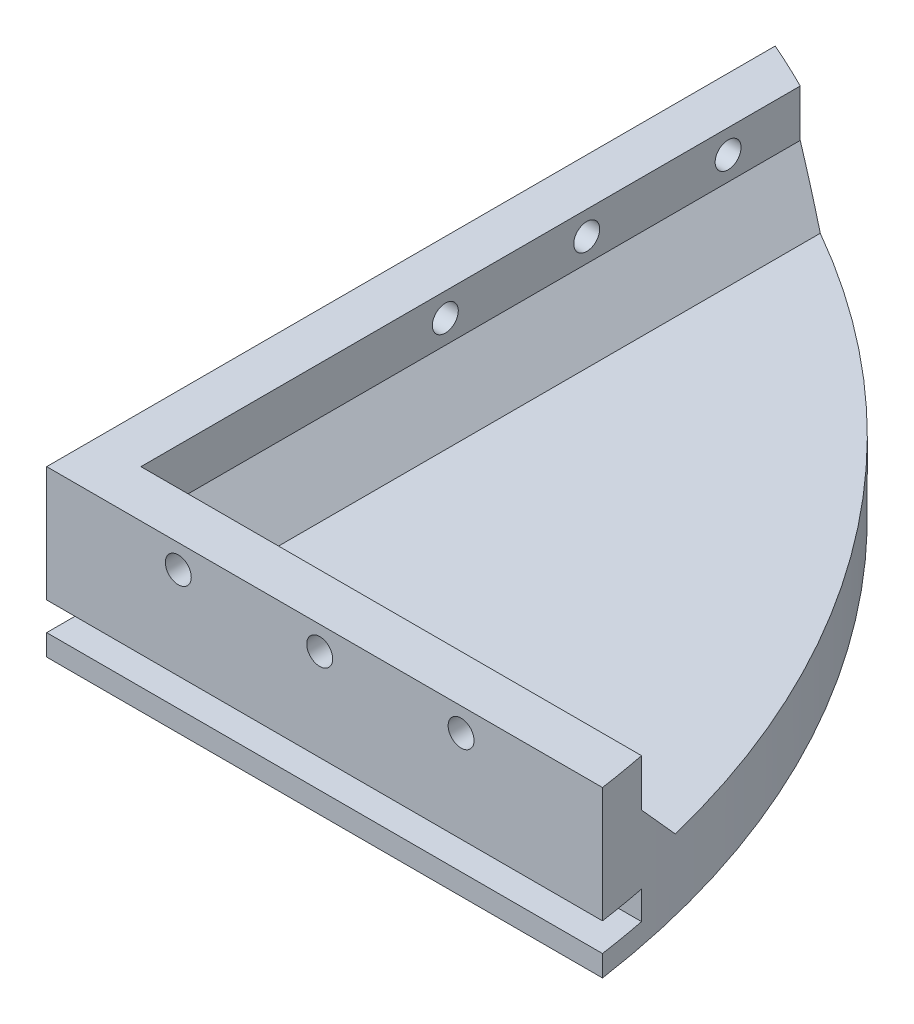
ISO-10303-21;
HEADER;
FILE_DESCRIPTION(('STEP AP214'),'2;1');
FILE_NAME('part.step','',(''),(''),'','','');
FILE_SCHEMA(('AUTOMOTIVE_DESIGN { 1 0 10303 214 1 1 1 1 }'));
ENDSEC;
DATA;
#1=APPLICATION_CONTEXT('core data for automotive mechanical design processes');
#2=APPLICATION_PROTOCOL_DEFINITION('international standard','automotive_design',2000,#1);
#3=PRODUCT_CONTEXT('',#1,'mechanical');
#4=PRODUCT('Part','Part','',(#3));
#5=PRODUCT_RELATED_PRODUCT_CATEGORY('part','',(#4));
#6=PRODUCT_DEFINITION_FORMATION('','',#4);
#7=PRODUCT_DEFINITION_CONTEXT('part definition',#1,'design');
#8=PRODUCT_DEFINITION('design','',#6,#7);
#9=PRODUCT_DEFINITION_SHAPE('','',#8);
#10=(LENGTH_UNIT() NAMED_UNIT(*) SI_UNIT(.MILLI.,.METRE.));
#11=(NAMED_UNIT(*) PLANE_ANGLE_UNIT() SI_UNIT($,.RADIAN.));
#12=(NAMED_UNIT(*) SI_UNIT($,.STERADIAN.) SOLID_ANGLE_UNIT());
#13=UNCERTAINTY_MEASURE_WITH_UNIT(LENGTH_MEASURE(1.E-05),#10,'distance_accuracy_value','');
#14=(GEOMETRIC_REPRESENTATION_CONTEXT(3) GLOBAL_UNCERTAINTY_ASSIGNED_CONTEXT((#13)) GLOBAL_UNIT_ASSIGNED_CONTEXT((#10,
#11,#12)) REPRESENTATION_CONTEXT('',''));
#15=CARTESIAN_POINT('',(0.,0.,0.));
#16=DIRECTION('',(0.,0.,1.));
#17=DIRECTION('',(1.,0.,0.));
#18=AXIS2_PLACEMENT_3D('',#15,#16,#17);
#19=CARTESIAN_POINT('',(80.,0.,-28.7228132326902));
#20=DIRECTION('',(0.,0.,1.));
#21=DIRECTION('',(1.,0.,0.));
#22=AXIS2_PLACEMENT_3D('',#19,#20,#21);
#23=PLANE('',#22);
#24=CARTESIAN_POINT('',(107.926754128895,30.,-28.7228132326902));
#25=DIRECTION('',(0.,0.,1.));
#26=DIRECTION('',(1.,0.,0.));
#27=AXIS2_PLACEMENT_3D('',#24,#25,#26);
#28=CIRCLE('',#27,2.75000000000001);
#29=CARTESIAN_POINT('',(110.676754128895,30.,-28.7228132326902));
#30=VERTEX_POINT('',#29);
#31=EDGE_CURVE('E380',#30,#30,#28,.T.);
#32=ORIENTED_EDGE('',*,*,#31,.F.);
#33=EDGE_LOOP('',(#32));
#34=FACE_BOUND('',#33,.T.);
#35=CARTESIAN_POINT('',(167.926754128895,30.,-28.7228132326902));
#36=DIRECTION('',(0.,0.,1.));
#37=DIRECTION('',(1.,0.,0.));
#38=AXIS2_PLACEMENT_3D('',#35,#36,#37);
#39=CIRCLE('',#38,2.75000000000001);
#40=CARTESIAN_POINT('',(170.676754128895,30.,-28.7228132326902));
#41=VERTEX_POINT('',#40);
#42=EDGE_CURVE('E384',#41,#41,#39,.T.);
#43=ORIENTED_EDGE('',*,*,#42,.F.);
#44=EDGE_LOOP('',(#43));
#45=FACE_BOUND('',#44,.T.);
#46=CARTESIAN_POINT('',(137.926754128895,30.,-28.7228132326902));
#47=DIRECTION('',(0.,0.,1.));
#48=DIRECTION('',(1.,0.,0.));
#49=AXIS2_PLACEMENT_3D('',#46,#47,#48);
#50=CIRCLE('',#49,2.75000000000001);
#51=CARTESIAN_POINT('',(140.676754128895,30.,-28.7228132326902));
#52=VERTEX_POINT('',#51);
#53=EDGE_CURVE('E392',#52,#52,#50,.T.);
#54=ORIENTED_EDGE('',*,*,#53,.F.);
#55=EDGE_LOOP('',(#54));
#56=FACE_BOUND('',#55,.T.);
#57=DIRECTION('',(-1.,0.,0.));
#58=VECTOR('',#57,1.);
#59=CARTESIAN_POINT('',(80.,10.5,-28.7228132326902));
#60=LINE('',#59,#58);
#61=CARTESIAN_POINT('',(197.926754128895,10.5,-28.7228132326902));
#62=VERTEX_POINT('',#61);
#63=CARTESIAN_POINT('',(80.,10.5,-28.7228132326902));
#64=VERTEX_POINT('',#63);
#65=EDGE_CURVE('E160',#62,#64,#60,.T.);
#66=ORIENTED_EDGE('',*,*,#65,.F.);
#67=DIRECTION('',(0.,-1.,0.));
#68=VECTOR('',#67,1.);
#69=CARTESIAN_POINT('',(197.926754128895,15.,-28.7228132326902));
#70=LINE('',#69,#68);
#71=CARTESIAN_POINT('',(197.926754128895,35.,-28.7228132326902));
#72=VERTEX_POINT('',#71);
#73=EDGE_CURVE('E180',#62,#72,#70,.F.);
#74=ORIENTED_EDGE('',*,*,#73,.T.);
#75=DIRECTION('',(-1.,0.,0.));
#76=VECTOR('',#75,1.);
#77=CARTESIAN_POINT('',(80.,35.,-28.7228132326902));
#78=LINE('',#77,#76);
#79=CARTESIAN_POINT('',(80.,35.,-28.7228132326902));
#80=VERTEX_POINT('',#79);
#81=EDGE_CURVE('E259',#72,#80,#78,.T.);
#82=ORIENTED_EDGE('',*,*,#81,.T.);
#83=DIRECTION('',(0.,1.,0.));
#84=VECTOR('',#83,1.);
#85=CARTESIAN_POINT('',(80.,0.,-28.7228132326902));
#86=LINE('',#85,#84);
#87=EDGE_CURVE('E280',#64,#80,#86,.T.);
#88=ORIENTED_EDGE('',*,*,#87,.F.);
#89=EDGE_LOOP('',(#66,#74,#82,#88));
#90=FACE_BOUND('',#89,.T.);
#91=ADVANCED_FACE('F50',(#34,#45,#56,#90),#23,.T.);
#92=CARTESIAN_POINT('',(80.,0.,-28.7228132326902));
#93=DIRECTION('',(-1.,0.,0.));
#94=DIRECTION('',(0.,0.,1.));
#95=AXIS2_PLACEMENT_3D('',#92,#93,#94);
#96=PLANE('',#95);
#97=CARTESIAN_POINT('',(80.,30.,-163.303027798234));
#98=DIRECTION('',(-1.,0.,0.));
#99=DIRECTION('',(0.,0.,1.));
#100=AXIS2_PLACEMENT_3D('',#97,#98,#99);
#101=CIRCLE('',#100,2.75000000000001);
#102=CARTESIAN_POINT('',(80.,30.,-160.553027798234));
#103=VERTEX_POINT('',#102);
#104=EDGE_CURVE('E458',#103,#103,#101,.T.);
#105=ORIENTED_EDGE('',*,*,#104,.F.);
#106=EDGE_LOOP('',(#105));
#107=FACE_BOUND('',#106,.T.);
#108=CARTESIAN_POINT('',(80.,30.,-133.303027798234));
#109=DIRECTION('',(-1.,0.,0.));
#110=DIRECTION('',(0.,0.,1.));
#111=AXIS2_PLACEMENT_3D('',#108,#109,#110);
#112=CIRCLE('',#111,2.75000000000001);
#113=CARTESIAN_POINT('',(80.,30.,-130.553027798234));
#114=VERTEX_POINT('',#113);
#115=EDGE_CURVE('E460',#114,#114,#112,.T.);
#116=ORIENTED_EDGE('',*,*,#115,.F.);
#117=EDGE_LOOP('',(#116));
#118=FACE_BOUND('',#117,.T.);
#119=CARTESIAN_POINT('',(80.,30.,-103.303027798234));
#120=DIRECTION('',(-1.,0.,0.));
#121=DIRECTION('',(0.,0.,1.));
#122=AXIS2_PLACEMENT_3D('',#119,#120,#121);
#123=CIRCLE('',#122,2.75000000000001);
#124=CARTESIAN_POINT('',(80.,30.,-100.553027798234));
#125=VERTEX_POINT('',#124);
#126=EDGE_CURVE('E369',#125,#125,#123,.T.);
#127=ORIENTED_EDGE('',*,*,#126,.F.);
#128=EDGE_LOOP('',(#127));
#129=FACE_BOUND('',#128,.T.);
#130=DIRECTION('',(0.,0.,1.));
#131=VECTOR('',#130,1.);
#132=CARTESIAN_POINT('',(80.,10.5,-183.303027798234));
#133=LINE('',#132,#131);
#134=CARTESIAN_POINT('',(80.,10.5,-183.303027798234));
#135=VERTEX_POINT('',#134);
#136=EDGE_CURVE('E161',#135,#64,#133,.T.);
#137=ORIENTED_EDGE('',*,*,#136,.T.);
#138=ORIENTED_EDGE('',*,*,#87,.T.);
#139=DIRECTION('',(0.,0.,1.));
#140=VECTOR('',#139,1.);
#141=CARTESIAN_POINT('',(80.,35.,-188.72281323269));
#142=LINE('',#141,#140);
#143=CARTESIAN_POINT('',(80.,35.,-183.303027798234));
#144=VERTEX_POINT('',#143);
#145=EDGE_CURVE('E264',#144,#80,#142,.T.);
#146=ORIENTED_EDGE('',*,*,#145,.F.);
#147=DIRECTION('',(0.,-1.,0.));
#148=VECTOR('',#147,1.);
#149=CARTESIAN_POINT('',(80.,15.,-183.303027798234));
#150=LINE('',#149,#148);
#151=EDGE_CURVE('E186',#144,#135,#150,.T.);
#152=ORIENTED_EDGE('',*,*,#151,.T.);
#153=EDGE_LOOP('',(#137,#138,#146,#152));
#154=FACE_BOUND('',#153,.T.);
#155=ADVANCED_FACE('F290',(#107,#118,#129,#154),#96,.T.);
#156=CARTESIAN_POINT('',(90.,35.,-188.72281323269));
#157=DIRECTION('',(1.,0.,0.));
#158=DIRECTION('',(0.,0.,-1.));
#159=AXIS2_PLACEMENT_3D('',#156,#157,#158);
#160=PLANE('',#159);
#161=CARTESIAN_POINT('',(90.,30.,-163.303027798234));
#162=DIRECTION('',(-1.,0.,0.));
#163=DIRECTION('',(0.,0.,1.));
#164=AXIS2_PLACEMENT_3D('',#161,#162,#163);
#165=CIRCLE('',#164,2.75000000000001);
#166=CARTESIAN_POINT('',(90.,30.,-160.553027798234));
#167=VERTEX_POINT('',#166);
#168=EDGE_CURVE('E359',#167,#167,#165,.T.);
#169=ORIENTED_EDGE('',*,*,#168,.T.);
#170=EDGE_LOOP('',(#169));
#171=FACE_BOUND('',#170,.T.);
#172=CARTESIAN_POINT('',(90.,30.,-133.303027798234));
#173=DIRECTION('',(-1.,0.,0.));
#174=DIRECTION('',(0.,0.,1.));
#175=AXIS2_PLACEMENT_3D('',#172,#173,#174);
#176=CIRCLE('',#175,2.75000000000001);
#177=CARTESIAN_POINT('',(90.,30.,-130.553027798234));
#178=VERTEX_POINT('',#177);
#179=EDGE_CURVE('E363',#178,#178,#176,.T.);
#180=ORIENTED_EDGE('',*,*,#179,.T.);
#181=EDGE_LOOP('',(#180));
#182=FACE_BOUND('',#181,.T.);
#183=CARTESIAN_POINT('',(90.,30.,-103.303027798234));
#184=DIRECTION('',(-1.,0.,0.));
#185=DIRECTION('',(0.,0.,1.));
#186=AXIS2_PLACEMENT_3D('',#183,#184,#185);
#187=CIRCLE('',#186,2.75000000000001);
#188=CARTESIAN_POINT('',(90.,30.,-100.553027798234));
#189=VERTEX_POINT('',#188);
#190=EDGE_CURVE('E366',#189,#189,#187,.T.);
#191=ORIENTED_EDGE('',*,*,#190,.T.);
#192=EDGE_LOOP('',(#191));
#193=FACE_BOUND('',#192,.T.);
#194=DIRECTION('',(0.,0.,1.));
#195=VECTOR('',#194,1.);
#196=CARTESIAN_POINT('',(90.,25.,-188.72281323269));
#197=LINE('',#196,#195);
#198=CARTESIAN_POINT('',(90.,25.,-178.605710994918));
#199=VERTEX_POINT('',#198);
#200=CARTESIAN_POINT('',(90.,25.,-38.7228132326902));
#201=VERTEX_POINT('',#200);
#202=EDGE_CURVE('E263',#199,#201,#197,.T.);
#203=ORIENTED_EDGE('',*,*,#202,.F.);
#204=DIRECTION('',(0.,1.,0.));
#205=VECTOR('',#204,1.);
#206=CARTESIAN_POINT('',(90.,-1.2E-05,-178.605710994918));
#207=LINE('',#206,#205);
#208=CARTESIAN_POINT('',(90.,35.,-178.605710994918));
#209=VERTEX_POINT('',#208);
#210=EDGE_CURVE('E240',#199,#209,#207,.T.);
#211=ORIENTED_EDGE('',*,*,#210,.T.);
#212=DIRECTION('',(0.,0.,1.));
#213=VECTOR('',#212,1.);
#214=CARTESIAN_POINT('',(90.,35.,-188.72281323269));
#215=LINE('',#214,#213);
#216=CARTESIAN_POINT('',(90.,35.,-38.7228132326902));
#217=VERTEX_POINT('',#216);
#218=EDGE_CURVE('E268',#209,#217,#215,.T.);
#219=ORIENTED_EDGE('',*,*,#218,.T.);
#220=DIRECTION('',(0.,1.,0.));
#221=VECTOR('',#220,1.);
#222=CARTESIAN_POINT('',(90.,35.,-38.7228132326902));
#223=LINE('',#222,#221);
#224=EDGE_CURVE('E244',#201,#217,#223,.T.);
#225=ORIENTED_EDGE('',*,*,#224,.F.);
#226=EDGE_LOOP('',(#203,#211,#219,#225));
#227=FACE_BOUND('',#226,.T.);
#228=ADVANCED_FACE('F308',(#171,#182,#193,#227),#160,.T.);
#229=CARTESIAN_POINT('',(90.,25.,-188.72281323269));
#230=DIRECTION('',(0.736297776529826,0.67665765663091,0.));
#231=DIRECTION('',(-0.67665765663091,0.736297776529826,0.));
#232=AXIS2_PLACEMENT_3D('',#229,#230,#231);
#233=PLANE('',#232);
#234=DIRECTION('',(0.,0.,1.));
#235=VECTOR('',#234,1.);
#236=CARTESIAN_POINT('',(99.19,15.,-188.72281323269));
#237=LINE('',#236,#235);
#238=CARTESIAN_POINT('',(99.19,15.,-173.670215926623));
#239=VERTEX_POINT('',#238);
#240=CARTESIAN_POINT('',(99.19,15.,-47.9152013881153));
#241=VERTEX_POINT('',#240);
#242=EDGE_CURVE('E192',#239,#241,#237,.T.);
#243=ORIENTED_EDGE('',*,*,#242,.F.);
#244=CARTESIAN_POINT('',(0.,122.932535364527,0.));
#245=DIRECTION('',(0.736297776529826,0.67665765663091,0.));
#246=DIRECTION('',(-0.67665765663091,0.736297776529826,0.));
#247=AXIS2_PLACEMENT_3D('',#244,#245,#246);
#248=ELLIPSE('',#247,295.570438079137,200.);
#249=EDGE_CURVE('E236',#239,#199,#248,.T.);
#250=ORIENTED_EDGE('',*,*,#249,.T.);
#251=ORIENTED_EDGE('',*,*,#202,.T.);
#252=DIRECTION('',(0.560369916438498,-0.609760518431445,-0.560515536727508));
#253=VECTOR('',#252,1.);
#254=CARTESIAN_POINT('',(137.114406671771,-26.2670366395767,-85.8494632696292));
#255=LINE('',#254,#253);
#256=EDGE_CURVE('E194',#201,#241,#255,.T.);
#257=ORIENTED_EDGE('',*,*,#256,.T.);
#258=EDGE_LOOP('',(#243,#250,#251,#257));
#259=FACE_BOUND('',#258,.T.);
#260=ADVANCED_FACE('F312',(#259),#233,.T.);
#261=CARTESIAN_POINT('',(197.926754128895,0.,-28.7228132326902));
#262=VERTEX_POINT('',#261);
#263=CARTESIAN_POINT('',(197.926754128895,4.5,-28.7228132326902));
#264=VERTEX_POINT('',#263);
#265=EDGE_CURVE('E168',#262,#264,#70,.F.);
#266=ORIENTED_EDGE('',*,*,#265,.T.);
#267=DIRECTION('',(1.,0.,0.));
#268=VECTOR('',#267,1.);
#269=CARTESIAN_POINT('',(80.,4.5,-28.7228132326902));
#270=LINE('',#269,#268);
#271=CARTESIAN_POINT('',(80.,4.5,-28.7228132326902));
#272=VERTEX_POINT('',#271);
#273=EDGE_CURVE('E148',#272,#264,#270,.T.);
#274=ORIENTED_EDGE('',*,*,#273,.F.);
#275=CARTESIAN_POINT('',(80.,0.,-28.7228132326902));
#276=VERTEX_POINT('',#275);
#277=EDGE_CURVE('E281',#276,#272,#86,.T.);
#278=ORIENTED_EDGE('',*,*,#277,.F.);
#279=DIRECTION('',(1.,0.,0.));
#280=VECTOR('',#279,1.);
#281=CARTESIAN_POINT('',(80.,0.,-28.7228132326902));
#282=LINE('',#281,#280);
#283=EDGE_CURVE('E177',#276,#262,#282,.T.);
#284=ORIENTED_EDGE('',*,*,#283,.T.);
#285=EDGE_LOOP('',(#266,#274,#278,#284));
#286=FACE_BOUND('',#285,.T.);
#287=ADVANCED_FACE('F175',(#286),#23,.T.);
#288=DIRECTION('',(0.,0.,1.));
#289=VECTOR('',#288,1.);
#290=CARTESIAN_POINT('',(80.,4.5,-183.303027798234));
#291=LINE('',#290,#289);
#292=CARTESIAN_POINT('',(80.,4.5,-183.303027798234));
#293=VERTEX_POINT('',#292);
#294=EDGE_CURVE('E154',#293,#272,#291,.T.);
#295=ORIENTED_EDGE('',*,*,#294,.F.);
#296=CARTESIAN_POINT('',(80.,0.,-183.303027798234));
#297=VERTEX_POINT('',#296);
#298=EDGE_CURVE('E283',#293,#297,#150,.T.);
#299=ORIENTED_EDGE('',*,*,#298,.T.);
#300=DIRECTION('',(0.,0.,1.));
#301=VECTOR('',#300,1.);
#302=CARTESIAN_POINT('',(80.,0.,-28.7228132326902));
#303=LINE('',#302,#301);
#304=EDGE_CURVE('E278',#297,#276,#303,.T.);
#305=ORIENTED_EDGE('',*,*,#304,.T.);
#306=ORIENTED_EDGE('',*,*,#277,.T.);
#307=EDGE_LOOP('',(#295,#299,#305,#306));
#308=FACE_BOUND('',#307,.T.);
#309=ADVANCED_FACE('F327',(#308),#96,.T.);
#310=CARTESIAN_POINT('',(80.,35.,-188.72281323269));
#311=DIRECTION('',(0.,1.,0.));
#312=DIRECTION('',(0.,0.,1.));
#313=AXIS2_PLACEMENT_3D('',#310,#311,#312);
#314=PLANE('',#313);
#315=ORIENTED_EDGE('',*,*,#81,.F.);
#316=CARTESIAN_POINT('',(0.,35.,0.));
#317=DIRECTION('',(0.,1.,0.));
#318=DIRECTION('',(0.,0.,1.));
#319=AXIS2_PLACEMENT_3D('',#316,#317,#318);
#320=CIRCLE('',#319,200.);
#321=CARTESIAN_POINT('',(196.215554264554,35.,-38.7228132326902));
#322=VERTEX_POINT('',#321);
#323=EDGE_CURVE('E229',#72,#322,#320,.T.);
#324=ORIENTED_EDGE('',*,*,#323,.T.);
#325=DIRECTION('',(-1.,0.,0.));
#326=VECTOR('',#325,1.);
#327=CARTESIAN_POINT('',(250.,35.,-38.7228132326902));
#328=LINE('',#327,#326);
#329=EDGE_CURVE('E248',#322,#217,#328,.T.);
#330=ORIENTED_EDGE('',*,*,#329,.T.);
#331=ORIENTED_EDGE('',*,*,#218,.F.);
#332=EDGE_CURVE('E228',#209,#144,#320,.T.);
#333=ORIENTED_EDGE('',*,*,#332,.T.);
#334=ORIENTED_EDGE('',*,*,#145,.T.);
#335=EDGE_LOOP('',(#315,#324,#330,#331,#333,#334));
#336=FACE_BOUND('',#335,.T.);
#337=ADVANCED_FACE('F295',(#336),#314,.T.);
#338=CARTESIAN_POINT('',(250.,25.,-38.7228132326902));
#339=DIRECTION('',(0.,-0.676752968183959,0.736210173832311));
#340=DIRECTION('',(0.,-0.736210173832311,-0.676752968183959));
#341=AXIS2_PLACEMENT_3D('',#338,#339,#340);
#342=PLANE('',#341);
#343=CARTESIAN_POINT('',(0.,67.1248674207007,0.));
#344=DIRECTION('',(0.,-0.676752968183959,0.736210173832311));
#345=DIRECTION('',(0.,0.736210173832311,0.676752968183959));
#346=AXIS2_PLACEMENT_3D('',#343,#344,#345);
#347=ELLIPSE('',#346,295.52881095844,200.);
#348=CARTESIAN_POINT('',(194.175522339806,15.,-47.9152013881153));
#349=VERTEX_POINT('',#348);
#350=CARTESIAN_POINT('',(196.215554264554,25.,-38.7228132326902));
#351=VERTEX_POINT('',#350);
#352=EDGE_CURVE('E233',#349,#351,#347,.T.);
#353=ORIENTED_EDGE('',*,*,#352,.F.);
#354=DIRECTION('',(-1.,0.,0.));
#355=VECTOR('',#354,1.);
#356=CARTESIAN_POINT('',(250.,15.,-47.9152013881153));
#357=LINE('',#356,#355);
#358=EDGE_CURVE('E256',#349,#241,#357,.T.);
#359=ORIENTED_EDGE('',*,*,#358,.T.);
#360=ORIENTED_EDGE('',*,*,#256,.F.);
#361=DIRECTION('',(-1.,0.,0.));
#362=VECTOR('',#361,1.);
#363=CARTESIAN_POINT('',(250.,25.,-38.7228132326902));
#364=LINE('',#363,#362);
#365=EDGE_CURVE('E252',#351,#201,#364,.T.);
#366=ORIENTED_EDGE('',*,*,#365,.F.);
#367=EDGE_LOOP('',(#353,#359,#360,#366));
#368=FACE_BOUND('',#367,.T.);
#369=ADVANCED_FACE('F317',(#368),#342,.F.);
#370=CARTESIAN_POINT('',(250.,35.,-38.7228132326902));
#371=DIRECTION('',(0.,0.,1.));
#372=DIRECTION('',(1.,0.,0.));
#373=AXIS2_PLACEMENT_3D('',#370,#371,#372);
#374=PLANE('',#373);
#375=CARTESIAN_POINT('',(107.926754128895,30.,-38.7228132326902));
#376=DIRECTION('',(0.,0.,1.));
#377=DIRECTION('',(1.,0.,0.));
#378=AXIS2_PLACEMENT_3D('',#375,#376,#377);
#379=CIRCLE('',#378,2.75000000000001);
#380=CARTESIAN_POINT('',(110.676754128895,30.,-38.7228132326902));
#381=VERTEX_POINT('',#380);
#382=EDGE_CURVE('E376',#381,#381,#379,.T.);
#383=ORIENTED_EDGE('',*,*,#382,.T.);
#384=EDGE_LOOP('',(#383));
#385=FACE_BOUND('',#384,.T.);
#386=CARTESIAN_POINT('',(167.926754128895,30.,-38.7228132326902));
#387=DIRECTION('',(0.,0.,1.));
#388=DIRECTION('',(1.,0.,0.));
#389=AXIS2_PLACEMENT_3D('',#386,#387,#388);
#390=CIRCLE('',#389,2.75000000000001);
#391=CARTESIAN_POINT('',(170.676754128895,30.,-38.7228132326902));
#392=VERTEX_POINT('',#391);
#393=EDGE_CURVE('E388',#392,#392,#390,.T.);
#394=ORIENTED_EDGE('',*,*,#393,.T.);
#395=EDGE_LOOP('',(#394));
#396=FACE_BOUND('',#395,.T.);
#397=CARTESIAN_POINT('',(137.926754128895,30.,-38.7228132326902));
#398=DIRECTION('',(0.,0.,1.));
#399=DIRECTION('',(1.,0.,0.));
#400=AXIS2_PLACEMENT_3D('',#397,#398,#399);
#401=CIRCLE('',#400,2.75000000000001);
#402=CARTESIAN_POINT('',(140.676754128895,30.,-38.7228132326902));
#403=VERTEX_POINT('',#402);
#404=EDGE_CURVE('E396',#403,#403,#401,.T.);
#405=ORIENTED_EDGE('',*,*,#404,.T.);
#406=EDGE_LOOP('',(#405));
#407=FACE_BOUND('',#406,.T.);
#408=DIRECTION('',(0.,1.,0.));
#409=VECTOR('',#408,1.);
#410=CARTESIAN_POINT('',(196.215554264554,-1.2E-05,-38.7228132326902));
#411=LINE('',#410,#409);
#412=EDGE_CURVE('E198',#351,#322,#411,.T.);
#413=ORIENTED_EDGE('',*,*,#412,.F.);
#414=ORIENTED_EDGE('',*,*,#365,.T.);
#415=ORIENTED_EDGE('',*,*,#224,.T.);
#416=ORIENTED_EDGE('',*,*,#329,.F.);
#417=EDGE_LOOP('',(#413,#414,#415,#416));
#418=FACE_BOUND('',#417,.T.);
#419=ADVANCED_FACE('F302',(#385,#396,#407,#418),#374,.F.);
#420=CARTESIAN_POINT('',(0.,15.,0.));
#421=DIRECTION('',(0.,1.,0.));
#422=DIRECTION('',(0.,0.,1.));
#423=AXIS2_PLACEMENT_3D('',#420,#421,#422);
#424=PLANE('',#423);
#425=ORIENTED_EDGE('',*,*,#242,.T.);
#426=ORIENTED_EDGE('',*,*,#358,.F.);
#427=CARTESIAN_POINT('',(0.,15.,0.));
#428=DIRECTION('',(0.,1.,0.));
#429=DIRECTION('',(0.,0.,1.));
#430=AXIS2_PLACEMENT_3D('',#427,#428,#429);
#431=CIRCLE('',#430,200.);
#432=EDGE_CURVE('E184',#349,#239,#431,.T.);
#433=ORIENTED_EDGE('',*,*,#432,.T.);
#434=EDGE_LOOP('',(#425,#426,#433));
#435=FACE_BOUND('',#434,.T.);
#436=ADVANCED_FACE('F315',(#435),#424,.T.);
#437=CARTESIAN_POINT('',(0.,15.,0.));
#438=DIRECTION('',(0.,-1.,0.));
#439=DIRECTION('',(0.,0.,-1.));
#440=AXIS2_PLACEMENT_3D('',#437,#438,#439);
#441=CYLINDRICAL_SURFACE('',#440,200.);
#442=ORIENTED_EDGE('',*,*,#73,.F.);
#443=CARTESIAN_POINT('',(0.,10.5,0.));
#444=DIRECTION('',(0.,1.,0.));
#445=DIRECTION('',(0.,0.,1.));
#446=AXIS2_PLACEMENT_3D('',#443,#444,#445);
#447=CIRCLE('',#446,200.);
#448=CARTESIAN_POINT('',(196.215554264554,10.5,-38.7228132326902));
#449=VERTEX_POINT('',#448);
#450=EDGE_CURVE('E173',#62,#449,#447,.T.);
#451=ORIENTED_EDGE('',*,*,#450,.T.);
#452=DIRECTION('',(0.,-1.,0.));
#453=VECTOR('',#452,1.);
#454=CARTESIAN_POINT('',(196.215554264554,15.,-38.7228132326902));
#455=LINE('',#454,#453);
#456=CARTESIAN_POINT('',(196.215554264554,4.5,-38.7228132326902));
#457=VERTEX_POINT('',#456);
#458=EDGE_CURVE('E171',#449,#457,#455,.T.);
#459=ORIENTED_EDGE('',*,*,#458,.T.);
#460=CARTESIAN_POINT('',(0.,4.5,0.));
#461=DIRECTION('',(0.,-1.,0.));
#462=DIRECTION('',(0.,0.,-1.));
#463=AXIS2_PLACEMENT_3D('',#460,#461,#462);
#464=CIRCLE('',#463,200.);
#465=EDGE_CURVE('E151',#457,#264,#464,.T.);
#466=ORIENTED_EDGE('',*,*,#465,.T.);
#467=ORIENTED_EDGE('',*,*,#265,.F.);
#468=CARTESIAN_POINT('',(0.,0.,0.));
#469=DIRECTION('',(0.,1.,0.));
#470=DIRECTION('',(0.,0.,1.));
#471=AXIS2_PLACEMENT_3D('',#468,#469,#470);
#472=CIRCLE('',#471,200.);
#473=EDGE_CURVE('E179',#262,#297,#472,.T.);
#474=ORIENTED_EDGE('',*,*,#473,.T.);
#475=ORIENTED_EDGE('',*,*,#298,.F.);
#476=CARTESIAN_POINT('',(0.,4.49999999999999,0.));
#477=DIRECTION('',(0.,-1.,0.));
#478=DIRECTION('',(1.,0.,0.));
#479=AXIS2_PLACEMENT_3D('',#476,#477,#478);
#480=CIRCLE('',#479,200.);
#481=CARTESIAN_POINT('',(90.,4.5,-178.605710994918));
#482=VERTEX_POINT('',#481);
#483=EDGE_CURVE('E201',#293,#482,#480,.T.);
#484=ORIENTED_EDGE('',*,*,#483,.T.);
#485=DIRECTION('',(0.,-1.,0.));
#486=VECTOR('',#485,1.);
#487=CARTESIAN_POINT('',(90.,15.,-178.605710994918));
#488=LINE('',#487,#486);
#489=CARTESIAN_POINT('',(90.,10.5,-178.605710994918));
#490=VERTEX_POINT('',#489);
#491=EDGE_CURVE('E59',#482,#490,#488,.F.);
#492=ORIENTED_EDGE('',*,*,#491,.T.);
#493=CARTESIAN_POINT('',(0.,10.5,0.));
#494=DIRECTION('',(0.,1.,0.));
#495=DIRECTION('',(0.,0.,1.));
#496=AXIS2_PLACEMENT_3D('',#493,#494,#495);
#497=CIRCLE('',#496,200.);
#498=EDGE_CURVE('E12',#490,#135,#497,.T.);
#499=ORIENTED_EDGE('',*,*,#498,.T.);
#500=ORIENTED_EDGE('',*,*,#151,.F.);
#501=ORIENTED_EDGE('',*,*,#332,.F.);
#502=ORIENTED_EDGE('',*,*,#210,.F.);
#503=ORIENTED_EDGE('',*,*,#249,.F.);
#504=ORIENTED_EDGE('',*,*,#432,.F.);
#505=ORIENTED_EDGE('',*,*,#352,.T.);
#506=ORIENTED_EDGE('',*,*,#412,.T.);
#507=ORIENTED_EDGE('',*,*,#323,.F.);
#508=EDGE_LOOP('',(#442,#451,#459,#466,#467,#474,#475,#484,#492,#499,#500,#501,#502,#503,#504,
#505,#506,#507));
#509=FACE_BOUND('',#508,.T.);
#510=ADVANCED_FACE('F52',(#509),#441,.T.);
#511=CARTESIAN_POINT('',(0.,0.,0.));
#512=DIRECTION('',(0.,1.,0.));
#513=DIRECTION('',(0.,0.,1.));
#514=AXIS2_PLACEMENT_3D('',#511,#512,#513);
#515=PLANE('',#514);
#516=ORIENTED_EDGE('',*,*,#283,.F.);
#517=ORIENTED_EDGE('',*,*,#304,.F.);
#518=ORIENTED_EDGE('',*,*,#473,.F.);
#519=EDGE_LOOP('',(#516,#517,#518));
#520=FACE_BOUND('',#519,.T.);
#521=ADVANCED_FACE('F411',(#520),#515,.F.);
#522=CARTESIAN_POINT('',(80.,10.5,-183.303027798234));
#523=DIRECTION('',(0.,1.,0.));
#524=DIRECTION('',(0.,0.,1.));
#525=AXIS2_PLACEMENT_3D('',#522,#523,#524);
#526=PLANE('',#525);
#527=DIRECTION('',(0.,0.,1.));
#528=VECTOR('',#527,1.);
#529=CARTESIAN_POINT('',(90.,10.5,-183.303027798234));
#530=LINE('',#529,#528);
#531=CARTESIAN_POINT('',(90.,10.5,-38.7228132326902));
#532=VERTEX_POINT('',#531);
#533=EDGE_CURVE('E212',#490,#532,#530,.T.);
#534=ORIENTED_EDGE('',*,*,#533,.T.);
#535=DIRECTION('',(-1.,0.,0.));
#536=VECTOR('',#535,1.);
#537=CARTESIAN_POINT('',(197.926754128895,10.5,-38.7228132326902));
#538=LINE('',#537,#536);
#539=EDGE_CURVE('E66',#449,#532,#538,.T.);
#540=ORIENTED_EDGE('',*,*,#539,.F.);
#541=ORIENTED_EDGE('',*,*,#450,.F.);
#542=ORIENTED_EDGE('',*,*,#65,.T.);
#543=ORIENTED_EDGE('',*,*,#136,.F.);
#544=ORIENTED_EDGE('',*,*,#498,.F.);
#545=EDGE_LOOP('',(#534,#540,#541,#542,#543,#544));
#546=FACE_BOUND('',#545,.T.);
#547=ADVANCED_FACE('F409',(#546),#526,.F.);
#548=CARTESIAN_POINT('',(90.,10.5,-183.303027798234));
#549=DIRECTION('',(1.,0.,0.));
#550=DIRECTION('',(0.,0.,-1.));
#551=AXIS2_PLACEMENT_3D('',#548,#549,#550);
#552=PLANE('',#551);
#553=DIRECTION('',(0.,0.,1.));
#554=VECTOR('',#553,1.);
#555=CARTESIAN_POINT('',(90.,4.5,-183.303027798234));
#556=LINE('',#555,#554);
#557=CARTESIAN_POINT('',(90.,4.5,-38.7228132326902));
#558=VERTEX_POINT('',#557);
#559=EDGE_CURVE('E74',#482,#558,#556,.T.);
#560=ORIENTED_EDGE('',*,*,#559,.T.);
#561=DIRECTION('',(0.,1.,0.));
#562=VECTOR('',#561,1.);
#563=CARTESIAN_POINT('',(90.,10.5000000000002,-38.7228132326902));
#564=LINE('',#563,#562);
#565=EDGE_CURVE('E213',#558,#532,#564,.T.);
#566=ORIENTED_EDGE('',*,*,#565,.T.);
#567=ORIENTED_EDGE('',*,*,#533,.F.);
#568=ORIENTED_EDGE('',*,*,#491,.F.);
#569=EDGE_LOOP('',(#560,#566,#567,#568));
#570=FACE_BOUND('',#569,.T.);
#571=ADVANCED_FACE('F210',(#570),#552,.F.);
#572=CARTESIAN_POINT('',(90.,4.5,-183.303027798234));
#573=DIRECTION('',(0.,-1.,0.));
#574=DIRECTION('',(1.,0.,0.));
#575=AXIS2_PLACEMENT_3D('',#572,#573,#574);
#576=PLANE('',#575);
#577=ORIENTED_EDGE('',*,*,#294,.T.);
#578=ORIENTED_EDGE('',*,*,#273,.T.);
#579=ORIENTED_EDGE('',*,*,#465,.F.);
#580=DIRECTION('',(-1.,0.,0.));
#581=VECTOR('',#580,1.);
#582=CARTESIAN_POINT('',(197.926754128895,4.5,-38.7228132326902));
#583=LINE('',#582,#581);
#584=EDGE_CURVE('E400',#457,#558,#583,.T.);
#585=ORIENTED_EDGE('',*,*,#584,.T.);
#586=ORIENTED_EDGE('',*,*,#559,.F.);
#587=ORIENTED_EDGE('',*,*,#483,.F.);
#588=EDGE_LOOP('',(#577,#578,#579,#585,#586,#587));
#589=FACE_BOUND('',#588,.T.);
#590=ADVANCED_FACE('F150',(#589),#576,.F.);
#591=CARTESIAN_POINT('',(197.926754128895,4.5,-38.7228132326902));
#592=DIRECTION('',(0.,0.,-1.));
#593=DIRECTION('',(0.,1.,0.));
#594=AXIS2_PLACEMENT_3D('',#591,#592,#593);
#595=PLANE('',#594);
#596=ORIENTED_EDGE('',*,*,#539,.T.);
#597=ORIENTED_EDGE('',*,*,#565,.F.);
#598=ORIENTED_EDGE('',*,*,#584,.F.);
#599=ORIENTED_EDGE('',*,*,#458,.F.);
#600=EDGE_LOOP('',(#596,#597,#598,#599));
#601=FACE_BOUND('',#600,.T.);
#602=ADVANCED_FACE('F420',(#601),#595,.F.);
#603=CARTESIAN_POINT('',(137.926754128895,30.,-38.7228132326902));
#604=DIRECTION('',(0.,0.,1.));
#605=DIRECTION('',(1.,0.,0.));
#606=AXIS2_PLACEMENT_3D('',#603,#604,#605);
#607=CYLINDRICAL_SURFACE('',#606,2.75000000000001);
#608=ORIENTED_EDGE('',*,*,#404,.F.);
#609=EDGE_LOOP('',(#608));
#610=FACE_BOUND('',#609,.T.);
#611=ORIENTED_EDGE('',*,*,#53,.T.);
#612=EDGE_LOOP('',(#611));
#613=FACE_BOUND('',#612,.T.);
#614=ADVANCED_FACE('F426',(#610,#613),#607,.F.);
#615=CARTESIAN_POINT('',(167.926754128895,30.,-38.7228132326902));
#616=DIRECTION('',(0.,0.,1.));
#617=DIRECTION('',(1.,0.,0.));
#618=AXIS2_PLACEMENT_3D('',#615,#616,#617);
#619=CYLINDRICAL_SURFACE('',#618,2.75000000000001);
#620=ORIENTED_EDGE('',*,*,#393,.F.);
#621=EDGE_LOOP('',(#620));
#622=FACE_BOUND('',#621,.T.);
#623=ORIENTED_EDGE('',*,*,#42,.T.);
#624=EDGE_LOOP('',(#623));
#625=FACE_BOUND('',#624,.T.);
#626=ADVANCED_FACE('F430',(#622,#625),#619,.F.);
#627=CARTESIAN_POINT('',(107.926754128895,30.,-38.7228132326902));
#628=DIRECTION('',(0.,0.,1.));
#629=DIRECTION('',(1.,0.,0.));
#630=AXIS2_PLACEMENT_3D('',#627,#628,#629);
#631=CYLINDRICAL_SURFACE('',#630,2.75000000000001);
#632=ORIENTED_EDGE('',*,*,#382,.F.);
#633=EDGE_LOOP('',(#632));
#634=FACE_BOUND('',#633,.T.);
#635=ORIENTED_EDGE('',*,*,#31,.T.);
#636=EDGE_LOOP('',(#635));
#637=FACE_BOUND('',#636,.T.);
#638=ADVANCED_FACE('F435',(#634,#637),#631,.F.);
#639=CARTESIAN_POINT('',(90.,30.,-103.303027798234));
#640=DIRECTION('',(-1.,0.,0.));
#641=DIRECTION('',(0.,0.,1.));
#642=AXIS2_PLACEMENT_3D('',#639,#640,#641);
#643=CYLINDRICAL_SURFACE('',#642,2.75000000000001);
#644=ORIENTED_EDGE('',*,*,#190,.F.);
#645=EDGE_LOOP('',(#644));
#646=FACE_BOUND('',#645,.T.);
#647=ORIENTED_EDGE('',*,*,#126,.T.);
#648=EDGE_LOOP('',(#647));
#649=FACE_BOUND('',#648,.T.);
#650=ADVANCED_FACE('F443',(#646,#649),#643,.F.);
#651=CARTESIAN_POINT('',(90.,30.,-133.303027798234));
#652=DIRECTION('',(-1.,0.,0.));
#653=DIRECTION('',(0.,0.,1.));
#654=AXIS2_PLACEMENT_3D('',#651,#652,#653);
#655=CYLINDRICAL_SURFACE('',#654,2.75000000000001);
#656=ORIENTED_EDGE('',*,*,#179,.F.);
#657=EDGE_LOOP('',(#656));
#658=FACE_BOUND('',#657,.T.);
#659=ORIENTED_EDGE('',*,*,#115,.T.);
#660=EDGE_LOOP('',(#659));
#661=FACE_BOUND('',#660,.T.);
#662=ADVANCED_FACE('F446',(#658,#661),#655,.F.);
#663=CARTESIAN_POINT('',(90.,30.,-163.303027798234));
#664=DIRECTION('',(-1.,0.,0.));
#665=DIRECTION('',(0.,0.,1.));
#666=AXIS2_PLACEMENT_3D('',#663,#664,#665);
#667=CYLINDRICAL_SURFACE('',#666,2.75000000000001);
#668=ORIENTED_EDGE('',*,*,#168,.F.);
#669=EDGE_LOOP('',(#668));
#670=FACE_BOUND('',#669,.T.);
#671=ORIENTED_EDGE('',*,*,#104,.T.);
#672=EDGE_LOOP('',(#671));
#673=FACE_BOUND('',#672,.T.);
#674=ADVANCED_FACE('F449',(#670,#673),#667,.F.);
#675=CLOSED_SHELL('',(#91,#155,#228,#260,#287,#309,#337,#369,#419,#436,#510,#521,#547,#571,#590,
#602,#614,#626,#638,#650,#662,#674));
#676=MANIFOLD_SOLID_BREP('B2',#675);
#677=ADVANCED_BREP_SHAPE_REPRESENTATION('',(#18,#676),#14);
#678=SHAPE_DEFINITION_REPRESENTATION(#9,#677);
ENDSEC;
END-ISO-10303-21;
